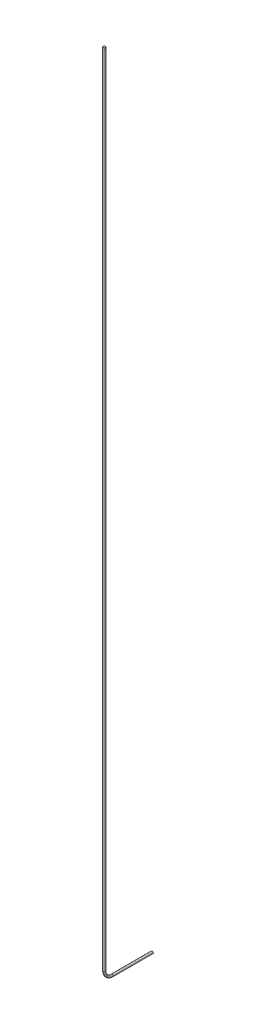
ISO-10303-21;
HEADER;
FILE_DESCRIPTION(('STEP AP214'),'2;1');
FILE_NAME('part.step','',(''),(''),'','','');
FILE_SCHEMA(('AUTOMOTIVE_DESIGN { 1 0 10303 214 1 1 1 1 }'));
ENDSEC;
DATA;
#1=APPLICATION_CONTEXT('core data for automotive mechanical design processes');
#2=APPLICATION_PROTOCOL_DEFINITION('international standard','automotive_design',2000,#1);
#3=PRODUCT_CONTEXT('',#1,'mechanical');
#4=PRODUCT('Part','Part','',(#3));
#5=PRODUCT_RELATED_PRODUCT_CATEGORY('part','',(#4));
#6=PRODUCT_DEFINITION_FORMATION('','',#4);
#7=PRODUCT_DEFINITION_CONTEXT('part definition',#1,'design');
#8=PRODUCT_DEFINITION('design','',#6,#7);
#9=PRODUCT_DEFINITION_SHAPE('','',#8);
#10=(LENGTH_UNIT() NAMED_UNIT(*) SI_UNIT(.MILLI.,.METRE.));
#11=(NAMED_UNIT(*) PLANE_ANGLE_UNIT() SI_UNIT($,.RADIAN.));
#12=(NAMED_UNIT(*) SI_UNIT($,.STERADIAN.) SOLID_ANGLE_UNIT());
#13=UNCERTAINTY_MEASURE_WITH_UNIT(LENGTH_MEASURE(1.E-05),#10,'distance_accuracy_value','');
#14=(GEOMETRIC_REPRESENTATION_CONTEXT(3) GLOBAL_UNCERTAINTY_ASSIGNED_CONTEXT((#13)) GLOBAL_UNIT_ASSIGNED_CONTEXT((#10,
#11,#12)) REPRESENTATION_CONTEXT('',''));
#15=CARTESIAN_POINT('',(0.,0.,0.));
#16=DIRECTION('',(0.,0.,1.));
#17=DIRECTION('',(1.,0.,0.));
#18=AXIS2_PLACEMENT_3D('',#15,#16,#17);
#19=CARTESIAN_POINT('',(0.,0.,20.));
#20=DIRECTION('',(0.,0.,-1.));
#21=DIRECTION('',(-1.,0.,0.));
#22=AXIS2_PLACEMENT_3D('',#19,#20,#21);
#23=CYLINDRICAL_SURFACE('',#22,0.7);
#24=CARTESIAN_POINT('',(0.,0.,0.));
#25=DIRECTION('',(0.,0.,1.));
#26=DIRECTION('',(1.,0.,0.));
#27=AXIS2_PLACEMENT_3D('',#24,#25,#26);
#28=CIRCLE('',#27,0.7);
#29=CARTESIAN_POINT('',(0.7,0.,0.));
#30=VERTEX_POINT('',#29);
#31=EDGE_CURVE('E10',#30,#30,#28,.T.);
#32=ORIENTED_EDGE('',*,*,#31,.T.);
#33=EDGE_LOOP('',(#32));
#34=FACE_BOUND('',#33,.T.);
#35=CARTESIAN_POINT('',(0.,0.,25.));
#36=DIRECTION('',(0.,0.,1.));
#37=DIRECTION('',(1.,0.,0.));
#38=AXIS2_PLACEMENT_3D('',#35,#36,#37);
#39=CIRCLE('',#38,0.7);
#40=CARTESIAN_POINT('',(0.,-0.699999999999836,25.));
#41=VERTEX_POINT('',#40);
#42=EDGE_CURVE('E56',#41,#41,#39,.T.);
#43=ORIENTED_EDGE('',*,*,#42,.F.);
#44=EDGE_LOOP('',(#43));
#45=FACE_BOUND('',#44,.T.);
#46=ADVANCED_FACE('F39',(#34,#45),#23,.T.);
#47=CARTESIAN_POINT('',(0.,0.,0.));
#48=DIRECTION('',(0.,0.,1.));
#49=DIRECTION('',(1.,0.,0.));
#50=AXIS2_PLACEMENT_3D('',#47,#48,#49);
#51=PLANE('',#50);
#52=ORIENTED_EDGE('',*,*,#31,.F.);
#53=EDGE_LOOP('',(#52));
#54=FACE_BOUND('',#53,.T.);
#55=ADVANCED_FACE('F66',(#54),#51,.F.);
#56=CARTESIAN_POINT('',(0.,505.,30.));
#57=DIRECTION('',(0.,1.,0.));
#58=DIRECTION('',(1.,0.,0.));
#59=AXIS2_PLACEMENT_3D('',#56,#57,#58);
#60=PLANE('',#59);
#61=CARTESIAN_POINT('',(0.,505.,30.));
#62=DIRECTION('',(0.,1.,0.));
#63=DIRECTION('',(1.,0.,0.));
#64=AXIS2_PLACEMENT_3D('',#61,#62,#63);
#65=CIRCLE('',#64,0.7);
#66=CARTESIAN_POINT('',(0.7,505.,30.));
#67=VERTEX_POINT('',#66);
#68=EDGE_CURVE('E46',#67,#67,#65,.T.);
#69=ORIENTED_EDGE('',*,*,#68,.T.);
#70=EDGE_LOOP('',(#69));
#71=FACE_BOUND('',#70,.T.);
#72=ADVANCED_FACE('F70',(#71),#60,.T.);
#73=CARTESIAN_POINT('',(0.,5.,25.));
#74=DIRECTION('',(-1.,0.,0.));
#75=DIRECTION('',(0.,0.,1.));
#76=AXIS2_PLACEMENT_3D('',#73,#74,#75);
#77=TOROIDAL_SURFACE('',#76,4.99999999999984,0.7);
#78=CARTESIAN_POINT('',(0.,5.,30.));
#79=DIRECTION('',(0.,1.,0.));
#80=DIRECTION('',(1.,0.,0.));
#81=AXIS2_PLACEMENT_3D('',#78,#79,#80);
#82=CIRCLE('',#81,0.7);
#83=CARTESIAN_POINT('',(0.,5.,30.6999999999998));
#84=VERTEX_POINT('',#83);
#85=EDGE_CURVE('E51',#84,#84,#82,.T.);
#86=CARTESIAN_POINT('',(0.,5.,25.));
#87=DIRECTION('',(-1.,0.,0.));
#88=DIRECTION('',(0.,0.,1.));
#89=AXIS2_PLACEMENT_3D('',#86,#87,#88);
#90=CIRCLE('',#89,5.69999999999983);
#91=EDGE_CURVE('',#41,#84,#90,.T.);
#92=ORIENTED_EDGE('',*,*,#42,.T.);
#93=ORIENTED_EDGE('',*,*,#85,.F.);
#94=ORIENTED_EDGE('',*,*,#91,.T.);
#95=ORIENTED_EDGE('',*,*,#91,.F.);
#96=EDGE_LOOP('',(#92,#94,#93,#95));
#97=FACE_BOUND('',#96,.T.);
#98=ADVANCED_FACE('F63',(#97),#77,.T.);
#99=CARTESIAN_POINT('',(0.,5.,30.));
#100=DIRECTION('',(0.,1.,0.));
#101=DIRECTION('',(0.,0.,1.));
#102=AXIS2_PLACEMENT_3D('',#99,#100,#101);
#103=CYLINDRICAL_SURFACE('',#102,0.7);
#104=ORIENTED_EDGE('',*,*,#68,.F.);
#105=EDGE_LOOP('',(#104));
#106=FACE_BOUND('',#105,.T.);
#107=ORIENTED_EDGE('',*,*,#85,.T.);
#108=EDGE_LOOP('',(#107));
#109=FACE_BOUND('',#108,.T.);
#110=ADVANCED_FACE('F72',(#106,#109),#103,.T.);
#111=CLOSED_SHELL('',(#46,#55,#72,#98,#110));
#112=MANIFOLD_SOLID_BREP('B2',#111);
#113=ADVANCED_BREP_SHAPE_REPRESENTATION('',(#18,#112),#14);
#114=SHAPE_DEFINITION_REPRESENTATION(#9,#113);
ENDSEC;
END-ISO-10303-21;
